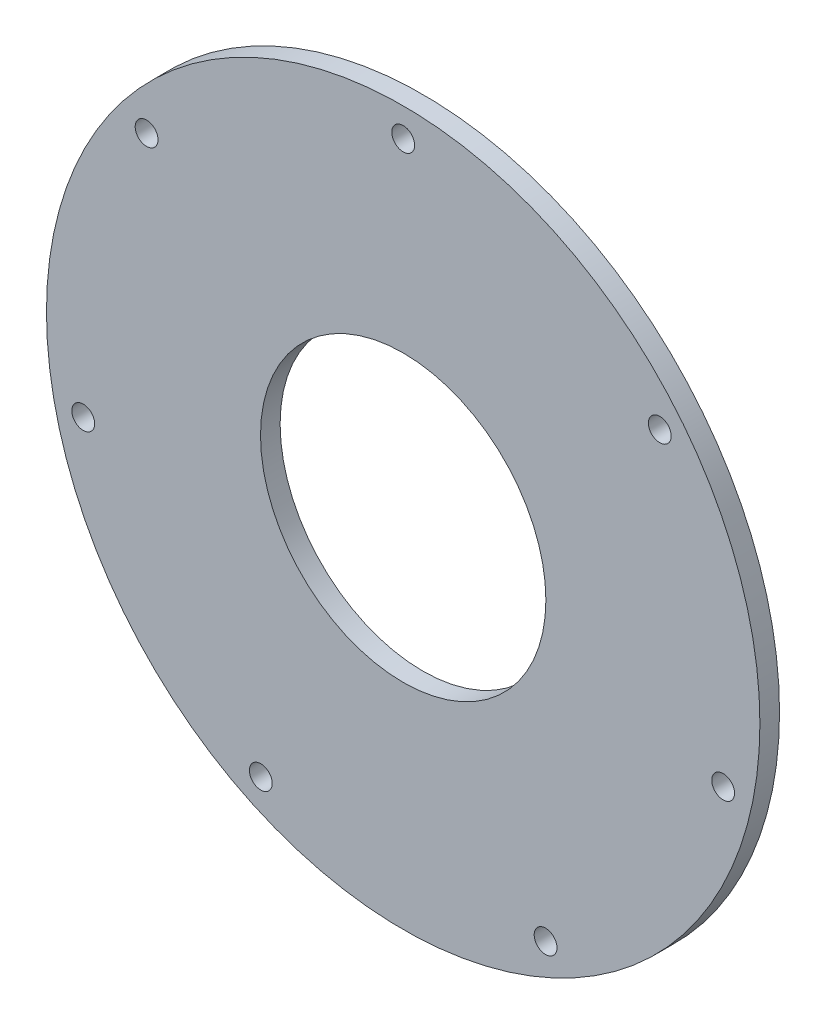
ISO-10303-21;
HEADER;
FILE_DESCRIPTION(('STEP AP214'),'2;1');
FILE_NAME('part.step','',(''),(''),'','','');
FILE_SCHEMA(('AUTOMOTIVE_DESIGN { 1 0 10303 214 1 1 1 1 }'));
ENDSEC;
DATA;
#1=APPLICATION_CONTEXT('core data for automotive mechanical design processes');
#2=APPLICATION_PROTOCOL_DEFINITION('international standard','automotive_design',2000,#1);
#3=PRODUCT_CONTEXT('',#1,'mechanical');
#4=PRODUCT('Part','Part','',(#3));
#5=PRODUCT_RELATED_PRODUCT_CATEGORY('part','',(#4));
#6=PRODUCT_DEFINITION_FORMATION('','',#4);
#7=PRODUCT_DEFINITION_CONTEXT('part definition',#1,'design');
#8=PRODUCT_DEFINITION('design','',#6,#7);
#9=PRODUCT_DEFINITION_SHAPE('','',#8);
#10=(LENGTH_UNIT() NAMED_UNIT(*) SI_UNIT(.MILLI.,.METRE.));
#11=(NAMED_UNIT(*) PLANE_ANGLE_UNIT() SI_UNIT($,.RADIAN.));
#12=(NAMED_UNIT(*) SI_UNIT($,.STERADIAN.) SOLID_ANGLE_UNIT());
#13=UNCERTAINTY_MEASURE_WITH_UNIT(LENGTH_MEASURE(1.E-05),#10,'distance_accuracy_value','');
#14=(GEOMETRIC_REPRESENTATION_CONTEXT(3) GLOBAL_UNCERTAINTY_ASSIGNED_CONTEXT((#13)) GLOBAL_UNIT_ASSIGNED_CONTEXT((#10,
#11,#12)) REPRESENTATION_CONTEXT('',''));
#15=CARTESIAN_POINT('',(0.,0.,0.));
#16=DIRECTION('',(0.,0.,1.));
#17=DIRECTION('',(1.,0.,0.));
#18=AXIS2_PLACEMENT_3D('',#15,#16,#17);
#19=CARTESIAN_POINT('',(0.,0.,2.75));
#20=DIRECTION('',(0.,0.,1.));
#21=DIRECTION('',(1.,0.,0.));
#22=AXIS2_PLACEMENT_3D('',#19,#20,#21);
#23=PLANE('',#22);
#24=CARTESIAN_POINT('',(35.964248193529,28.6805308855022,2.75));
#25=DIRECTION('',(0.,0.,1.));
#26=DIRECTION('',(1.,0.,0.));
#27=AXIS2_PLACEMENT_3D('',#24,#25,#26);
#28=CIRCLE('',#27,1.6);
#29=CARTESIAN_POINT('',(37.564248193529,28.6805308855022,2.75));
#30=VERTEX_POINT('',#29);
#31=EDGE_CURVE('E96',#30,#30,#28,.T.);
#32=ORIENTED_EDGE('',*,*,#31,.F.);
#33=EDGE_LOOP('',(#32));
#34=FACE_BOUND('',#33,.T.);
#35=CARTESIAN_POINT('',(44.846683960364,-10.23596296199,2.75));
#36=DIRECTION('',(0.,0.,1.));
#37=DIRECTION('',(1.,0.,0.));
#38=AXIS2_PLACEMENT_3D('',#35,#36,#37);
#39=CIRCLE('',#38,1.6);
#40=CARTESIAN_POINT('',(46.446683960364,-10.23596296199,2.75));
#41=VERTEX_POINT('',#40);
#42=EDGE_CURVE('E89',#41,#41,#39,.T.);
#43=ORIENTED_EDGE('',*,*,#42,.F.);
#44=EDGE_LOOP('',(#43));
#45=FACE_BOUND('',#44,.T.);
#46=CARTESIAN_POINT('',(19.958651999408,-41.4445679235111,2.75));
#47=DIRECTION('',(0.,0.,1.));
#48=DIRECTION('',(1.,0.,0.));
#49=AXIS2_PLACEMENT_3D('',#46,#47,#48);
#50=CIRCLE('',#49,1.6);
#51=CARTESIAN_POINT('',(21.558651999408,-41.4445679235111,2.75));
#52=VERTEX_POINT('',#51);
#53=EDGE_CURVE('E85',#52,#52,#50,.T.);
#54=ORIENTED_EDGE('',*,*,#53,.F.);
#55=EDGE_LOOP('',(#54));
#56=FACE_BOUND('',#55,.T.);
#57=CARTESIAN_POINT('',(-19.9586519994074,-41.4445679235114,2.75));
#58=DIRECTION('',(0.,0.,1.));
#59=DIRECTION('',(1.,0.,0.));
#60=AXIS2_PLACEMENT_3D('',#57,#58,#59);
#61=CIRCLE('',#60,1.6);
#62=CARTESIAN_POINT('',(-18.3586519994074,-41.4445679235114,2.75));
#63=VERTEX_POINT('',#62);
#64=EDGE_CURVE('E76',#63,#63,#61,.T.);
#65=ORIENTED_EDGE('',*,*,#64,.F.);
#66=EDGE_LOOP('',(#65));
#67=FACE_BOUND('',#66,.T.);
#68=CARTESIAN_POINT('',(-44.8466839603638,-10.2359629619906,2.75));
#69=DIRECTION('',(0.,0.,1.));
#70=DIRECTION('',(1.,0.,0.));
#71=AXIS2_PLACEMENT_3D('',#68,#69,#70);
#72=CIRCLE('',#71,1.6);
#73=CARTESIAN_POINT('',(-43.2466839603638,-10.2359629619906,2.75));
#74=VERTEX_POINT('',#73);
#75=EDGE_CURVE('E75',#74,#74,#72,.T.);
#76=ORIENTED_EDGE('',*,*,#75,.F.);
#77=EDGE_LOOP('',(#76));
#78=FACE_BOUND('',#77,.T.);
#79=CARTESIAN_POINT('',(-35.9642481935294,28.6805308855017,2.75));
#80=DIRECTION('',(0.,0.,1.));
#81=DIRECTION('',(1.,0.,0.));
#82=AXIS2_PLACEMENT_3D('',#79,#80,#81);
#83=CIRCLE('',#82,1.6);
#84=CARTESIAN_POINT('',(-34.3642481935294,28.6805308855017,2.75));
#85=VERTEX_POINT('',#84);
#86=EDGE_CURVE('E68',#85,#85,#83,.T.);
#87=ORIENTED_EDGE('',*,*,#86,.F.);
#88=EDGE_LOOP('',(#87));
#89=FACE_BOUND('',#88,.T.);
#90=CARTESIAN_POINT('',(0.,46.,2.75));
#91=DIRECTION('',(0.,0.,1.));
#92=DIRECTION('',(1.,0.,0.));
#93=AXIS2_PLACEMENT_3D('',#90,#91,#92);
#94=CIRCLE('',#93,1.6);
#95=CARTESIAN_POINT('',(1.6,46.,2.75));
#96=VERTEX_POINT('',#95);
#97=EDGE_CURVE('E58',#96,#96,#94,.T.);
#98=ORIENTED_EDGE('',*,*,#97,.F.);
#99=EDGE_LOOP('',(#98));
#100=FACE_BOUND('',#99,.T.);
#101=CARTESIAN_POINT('',(0.,0.,2.75));
#102=DIRECTION('',(0.,0.,1.));
#103=DIRECTION('',(1.,0.,0.));
#104=AXIS2_PLACEMENT_3D('',#101,#102,#103);
#105=CIRCLE('',#104,50.);
#106=CARTESIAN_POINT('',(50.,0.,2.75));
#107=VERTEX_POINT('',#106);
#108=EDGE_CURVE('E10',#107,#107,#105,.T.);
#109=ORIENTED_EDGE('',*,*,#108,.T.);
#110=EDGE_LOOP('',(#109));
#111=FACE_BOUND('',#110,.T.);
#112=CARTESIAN_POINT('',(0.,0.,2.75));
#113=DIRECTION('',(0.,0.,1.));
#114=DIRECTION('',(1.,0.,0.));
#115=AXIS2_PLACEMENT_3D('',#112,#113,#114);
#116=CIRCLE('',#115,20.);
#117=CARTESIAN_POINT('',(20.,0.,2.75));
#118=VERTEX_POINT('',#117);
#119=EDGE_CURVE('E49',#118,#118,#116,.T.);
#120=ORIENTED_EDGE('',*,*,#119,.F.);
#121=EDGE_LOOP('',(#120));
#122=FACE_BOUND('',#121,.T.);
#123=ADVANCED_FACE('F39',(#34,#45,#56,#67,#78,#89,#100,#111,#122),#23,.T.);
#124=CARTESIAN_POINT('',(0.,0.,0.));
#125=DIRECTION('',(0.,0.,1.));
#126=DIRECTION('',(1.,0.,0.));
#127=AXIS2_PLACEMENT_3D('',#124,#125,#126);
#128=PLANE('',#127);
#129=CARTESIAN_POINT('',(35.964248193529,28.6805308855022,0.));
#130=DIRECTION('',(0.,0.,1.));
#131=DIRECTION('',(1.,0.,0.));
#132=AXIS2_PLACEMENT_3D('',#129,#130,#131);
#133=CIRCLE('',#132,1.6);
#134=CARTESIAN_POINT('',(37.564248193529,28.6805308855022,0.));
#135=VERTEX_POINT('',#134);
#136=EDGE_CURVE('E91',#135,#135,#133,.T.);
#137=ORIENTED_EDGE('',*,*,#136,.T.);
#138=EDGE_LOOP('',(#137));
#139=FACE_BOUND('',#138,.T.);
#140=CARTESIAN_POINT('',(44.846683960364,-10.23596296199,0.));
#141=DIRECTION('',(0.,0.,1.));
#142=DIRECTION('',(1.,0.,0.));
#143=AXIS2_PLACEMENT_3D('',#140,#141,#142);
#144=CIRCLE('',#143,1.6);
#145=CARTESIAN_POINT('',(46.446683960364,-10.23596296199,0.));
#146=VERTEX_POINT('',#145);
#147=EDGE_CURVE('E87',#146,#146,#144,.T.);
#148=ORIENTED_EDGE('',*,*,#147,.T.);
#149=EDGE_LOOP('',(#148));
#150=FACE_BOUND('',#149,.T.);
#151=CARTESIAN_POINT('',(19.958651999408,-41.4445679235111,0.));
#152=DIRECTION('',(0.,0.,1.));
#153=DIRECTION('',(1.,0.,0.));
#154=AXIS2_PLACEMENT_3D('',#151,#152,#153);
#155=CIRCLE('',#154,1.6);
#156=CARTESIAN_POINT('',(21.558651999408,-41.4445679235111,0.));
#157=VERTEX_POINT('',#156);
#158=EDGE_CURVE('E83',#157,#157,#155,.T.);
#159=ORIENTED_EDGE('',*,*,#158,.T.);
#160=EDGE_LOOP('',(#159));
#161=FACE_BOUND('',#160,.T.);
#162=CARTESIAN_POINT('',(-19.9586519994074,-41.4445679235114,0.));
#163=DIRECTION('',(0.,0.,1.));
#164=DIRECTION('',(1.,0.,0.));
#165=AXIS2_PLACEMENT_3D('',#162,#163,#164);
#166=CIRCLE('',#165,1.6);
#167=CARTESIAN_POINT('',(-18.3586519994074,-41.4445679235114,0.));
#168=VERTEX_POINT('',#167);
#169=EDGE_CURVE('E73',#168,#168,#166,.T.);
#170=ORIENTED_EDGE('',*,*,#169,.T.);
#171=EDGE_LOOP('',(#170));
#172=FACE_BOUND('',#171,.T.);
#173=CARTESIAN_POINT('',(-44.8466839603638,-10.2359629619906,0.));
#174=DIRECTION('',(0.,0.,1.));
#175=DIRECTION('',(1.,0.,0.));
#176=AXIS2_PLACEMENT_3D('',#173,#174,#175);
#177=CIRCLE('',#176,1.6);
#178=CARTESIAN_POINT('',(-43.2466839603638,-10.2359629619906,0.));
#179=VERTEX_POINT('',#178);
#180=EDGE_CURVE('E70',#179,#179,#177,.T.);
#181=ORIENTED_EDGE('',*,*,#180,.T.);
#182=EDGE_LOOP('',(#181));
#183=FACE_BOUND('',#182,.T.);
#184=CARTESIAN_POINT('',(-35.9642481935294,28.6805308855017,0.));
#185=DIRECTION('',(0.,0.,1.));
#186=DIRECTION('',(1.,0.,0.));
#187=AXIS2_PLACEMENT_3D('',#184,#185,#186);
#188=CIRCLE('',#187,1.6);
#189=CARTESIAN_POINT('',(-34.3642481935294,28.6805308855017,0.));
#190=VERTEX_POINT('',#189);
#191=EDGE_CURVE('E61',#190,#190,#188,.T.);
#192=ORIENTED_EDGE('',*,*,#191,.T.);
#193=EDGE_LOOP('',(#192));
#194=FACE_BOUND('',#193,.T.);
#195=CARTESIAN_POINT('',(0.,46.,0.));
#196=DIRECTION('',(0.,0.,1.));
#197=DIRECTION('',(1.,0.,0.));
#198=AXIS2_PLACEMENT_3D('',#195,#196,#197);
#199=CIRCLE('',#198,1.6);
#200=CARTESIAN_POINT('',(1.6,46.,0.));
#201=VERTEX_POINT('',#200);
#202=EDGE_CURVE('E54',#201,#201,#199,.T.);
#203=ORIENTED_EDGE('',*,*,#202,.T.);
#204=EDGE_LOOP('',(#203));
#205=FACE_BOUND('',#204,.T.);
#206=CARTESIAN_POINT('',(0.,0.,0.));
#207=DIRECTION('',(0.,0.,1.));
#208=DIRECTION('',(1.,0.,0.));
#209=AXIS2_PLACEMENT_3D('',#206,#207,#208);
#210=CIRCLE('',#209,50.);
#211=CARTESIAN_POINT('',(50.,0.,0.));
#212=VERTEX_POINT('',#211);
#213=EDGE_CURVE('E43',#212,#212,#210,.T.);
#214=ORIENTED_EDGE('',*,*,#213,.F.);
#215=EDGE_LOOP('',(#214));
#216=FACE_BOUND('',#215,.T.);
#217=CARTESIAN_POINT('',(0.,0.,0.));
#218=DIRECTION('',(0.,0.,1.));
#219=DIRECTION('',(1.,0.,0.));
#220=AXIS2_PLACEMENT_3D('',#217,#218,#219);
#221=CIRCLE('',#220,20.);
#222=CARTESIAN_POINT('',(20.,0.,0.));
#223=VERTEX_POINT('',#222);
#224=EDGE_CURVE('E55',#223,#223,#221,.T.);
#225=ORIENTED_EDGE('',*,*,#224,.T.);
#226=EDGE_LOOP('',(#225));
#227=FACE_BOUND('',#226,.T.);
#228=ADVANCED_FACE('F102',(#139,#150,#161,#172,#183,#194,#205,#216,#227),#128,.F.);
#229=CARTESIAN_POINT('',(0.,0.,2.75));
#230=DIRECTION('',(0.,0.,-1.));
#231=DIRECTION('',(-1.,0.,0.));
#232=AXIS2_PLACEMENT_3D('',#229,#230,#231);
#233=CYLINDRICAL_SURFACE('',#232,50.);
#234=ORIENTED_EDGE('',*,*,#108,.F.);
#235=EDGE_LOOP('',(#234));
#236=FACE_BOUND('',#235,.T.);
#237=ORIENTED_EDGE('',*,*,#213,.T.);
#238=EDGE_LOOP('',(#237));
#239=FACE_BOUND('',#238,.T.);
#240=ADVANCED_FACE('F41',(#236,#239),#233,.T.);
#241=CARTESIAN_POINT('',(0.,0.,2.75));
#242=DIRECTION('',(0.,0.,-1.));
#243=DIRECTION('',(-1.,0.,0.));
#244=AXIS2_PLACEMENT_3D('',#241,#242,#243);
#245=CYLINDRICAL_SURFACE('',#244,20.);
#246=ORIENTED_EDGE('',*,*,#119,.T.);
#247=EDGE_LOOP('',(#246));
#248=FACE_BOUND('',#247,.T.);
#249=ORIENTED_EDGE('',*,*,#224,.F.);
#250=EDGE_LOOP('',(#249));
#251=FACE_BOUND('',#250,.T.);
#252=ADVANCED_FACE('F117',(#248,#251),#245,.F.);
#253=CARTESIAN_POINT('',(0.,46.,2.75));
#254=DIRECTION('',(0.,0.,1.));
#255=DIRECTION('',(1.,0.,0.));
#256=AXIS2_PLACEMENT_3D('',#253,#254,#255);
#257=CYLINDRICAL_SURFACE('',#256,1.6);
#258=ORIENTED_EDGE('',*,*,#202,.F.);
#259=EDGE_LOOP('',(#258));
#260=FACE_BOUND('',#259,.T.);
#261=ORIENTED_EDGE('',*,*,#97,.T.);
#262=EDGE_LOOP('',(#261));
#263=FACE_BOUND('',#262,.T.);
#264=ADVANCED_FACE('F122',(#260,#263),#257,.F.);
#265=CARTESIAN_POINT('',(-35.9642481935294,28.6805308855017,2.75));
#266=DIRECTION('',(0.,0.,1.));
#267=DIRECTION('',(1.,0.,0.));
#268=AXIS2_PLACEMENT_3D('',#265,#266,#267);
#269=CYLINDRICAL_SURFACE('',#268,1.6);
#270=ORIENTED_EDGE('',*,*,#191,.F.);
#271=EDGE_LOOP('',(#270));
#272=FACE_BOUND('',#271,.T.);
#273=ORIENTED_EDGE('',*,*,#86,.T.);
#274=EDGE_LOOP('',(#273));
#275=FACE_BOUND('',#274,.T.);
#276=ADVANCED_FACE('F137',(#272,#275),#269,.F.);
#277=CARTESIAN_POINT('',(-44.8466839603638,-10.2359629619906,2.75));
#278=DIRECTION('',(0.,0.,1.));
#279=DIRECTION('',(1.,0.,0.));
#280=AXIS2_PLACEMENT_3D('',#277,#278,#279);
#281=CYLINDRICAL_SURFACE('',#280,1.6);
#282=ORIENTED_EDGE('',*,*,#180,.F.);
#283=EDGE_LOOP('',(#282));
#284=FACE_BOUND('',#283,.T.);
#285=ORIENTED_EDGE('',*,*,#75,.T.);
#286=EDGE_LOOP('',(#285));
#287=FACE_BOUND('',#286,.T.);
#288=ADVANCED_FACE('F143',(#284,#287),#281,.F.);
#289=CARTESIAN_POINT('',(-19.9586519994074,-41.4445679235114,2.75));
#290=DIRECTION('',(0.,0.,1.));
#291=DIRECTION('',(1.,0.,0.));
#292=AXIS2_PLACEMENT_3D('',#289,#290,#291);
#293=CYLINDRICAL_SURFACE('',#292,1.6);
#294=ORIENTED_EDGE('',*,*,#169,.F.);
#295=EDGE_LOOP('',(#294));
#296=FACE_BOUND('',#295,.T.);
#297=ORIENTED_EDGE('',*,*,#64,.T.);
#298=EDGE_LOOP('',(#297));
#299=FACE_BOUND('',#298,.T.);
#300=ADVANCED_FACE('F144',(#296,#299),#293,.F.);
#301=CARTESIAN_POINT('',(19.958651999408,-41.4445679235111,2.75));
#302=DIRECTION('',(0.,0.,1.));
#303=DIRECTION('',(1.,0.,0.));
#304=AXIS2_PLACEMENT_3D('',#301,#302,#303);
#305=CYLINDRICAL_SURFACE('',#304,1.6);
#306=ORIENTED_EDGE('',*,*,#158,.F.);
#307=EDGE_LOOP('',(#306));
#308=FACE_BOUND('',#307,.T.);
#309=ORIENTED_EDGE('',*,*,#53,.T.);
#310=EDGE_LOOP('',(#309));
#311=FACE_BOUND('',#310,.T.);
#312=ADVANCED_FACE('F149',(#308,#311),#305,.F.);
#313=CARTESIAN_POINT('',(44.846683960364,-10.23596296199,2.75));
#314=DIRECTION('',(0.,0.,1.));
#315=DIRECTION('',(1.,0.,0.));
#316=AXIS2_PLACEMENT_3D('',#313,#314,#315);
#317=CYLINDRICAL_SURFACE('',#316,1.6);
#318=ORIENTED_EDGE('',*,*,#147,.F.);
#319=EDGE_LOOP('',(#318));
#320=FACE_BOUND('',#319,.T.);
#321=ORIENTED_EDGE('',*,*,#42,.T.);
#322=EDGE_LOOP('',(#321));
#323=FACE_BOUND('',#322,.T.);
#324=ADVANCED_FACE('F153',(#320,#323),#317,.F.);
#325=CARTESIAN_POINT('',(35.964248193529,28.6805308855022,2.75));
#326=DIRECTION('',(0.,0.,1.));
#327=DIRECTION('',(1.,0.,0.));
#328=AXIS2_PLACEMENT_3D('',#325,#326,#327);
#329=CYLINDRICAL_SURFACE('',#328,1.6);
#330=ORIENTED_EDGE('',*,*,#136,.F.);
#331=EDGE_LOOP('',(#330));
#332=FACE_BOUND('',#331,.T.);
#333=ORIENTED_EDGE('',*,*,#31,.T.);
#334=EDGE_LOOP('',(#333));
#335=FACE_BOUND('',#334,.T.);
#336=ADVANCED_FACE('F99',(#332,#335),#329,.F.);
#337=CLOSED_SHELL('',(#123,#228,#240,#252,#264,#276,#288,#300,#312,#324,#336));
#338=MANIFOLD_SOLID_BREP('B2',#337);
#339=ADVANCED_BREP_SHAPE_REPRESENTATION('',(#18,#338),#14);
#340=SHAPE_DEFINITION_REPRESENTATION(#9,#339);
ENDSEC;
END-ISO-10303-21;
